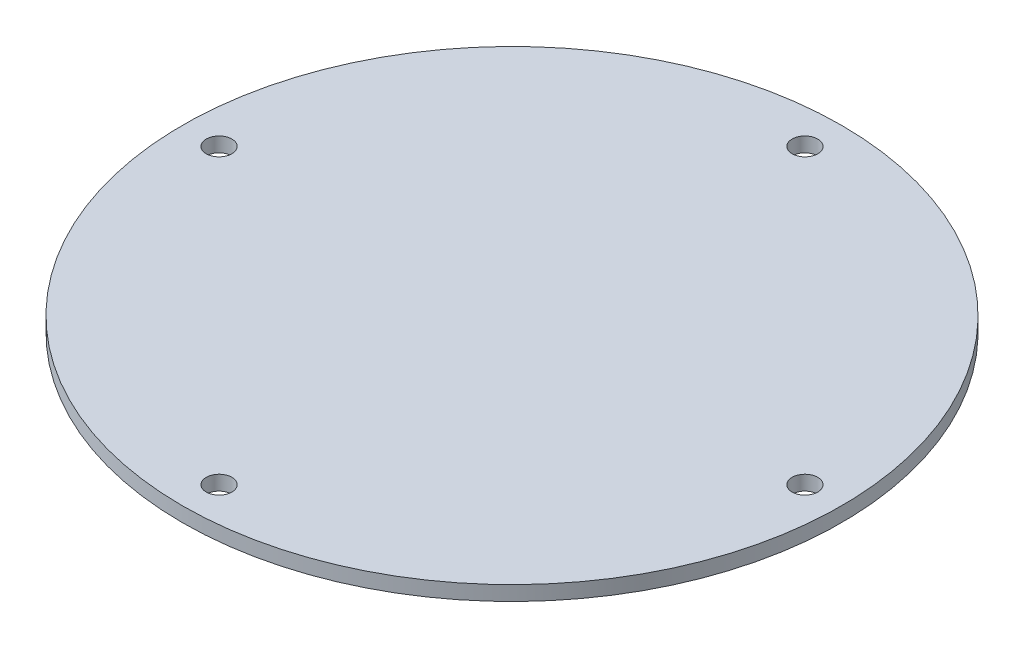
ISO-10303-21;
HEADER;
FILE_DESCRIPTION(('STEP AP214'),'2;1');
FILE_NAME('part.step','',(''),(''),'','','');
FILE_SCHEMA(('AUTOMOTIVE_DESIGN { 1 0 10303 214 1 1 1 1 }'));
ENDSEC;
DATA;
#1=APPLICATION_CONTEXT('core data for automotive mechanical design processes');
#2=APPLICATION_PROTOCOL_DEFINITION('international standard','automotive_design',2000,#1);
#3=PRODUCT_CONTEXT('',#1,'mechanical');
#4=PRODUCT('Part','Part','',(#3));
#5=PRODUCT_RELATED_PRODUCT_CATEGORY('part','',(#4));
#6=PRODUCT_DEFINITION_FORMATION('','',#4);
#7=PRODUCT_DEFINITION_CONTEXT('part definition',#1,'design');
#8=PRODUCT_DEFINITION('design','',#6,#7);
#9=PRODUCT_DEFINITION_SHAPE('','',#8);
#10=(LENGTH_UNIT() NAMED_UNIT(*) SI_UNIT(.MILLI.,.METRE.));
#11=(NAMED_UNIT(*) PLANE_ANGLE_UNIT() SI_UNIT($,.RADIAN.));
#12=(NAMED_UNIT(*) SI_UNIT($,.STERADIAN.) SOLID_ANGLE_UNIT());
#13=UNCERTAINTY_MEASURE_WITH_UNIT(LENGTH_MEASURE(1.E-05),#10,'distance_accuracy_value','');
#14=(GEOMETRIC_REPRESENTATION_CONTEXT(3) GLOBAL_UNCERTAINTY_ASSIGNED_CONTEXT((#13)) GLOBAL_UNIT_ASSIGNED_CONTEXT((#10,
#11,#12)) REPRESENTATION_CONTEXT('',''));
#15=CARTESIAN_POINT('',(0.,0.,0.));
#16=DIRECTION('',(0.,0.,1.));
#17=DIRECTION('',(1.,0.,0.));
#18=AXIS2_PLACEMENT_3D('',#15,#16,#17);
#19=CARTESIAN_POINT('',(0.,2.,0.));
#20=DIRECTION('',(0.,-1.,0.));
#21=DIRECTION('',(0.,0.,-1.));
#22=AXIS2_PLACEMENT_3D('',#19,#20,#21);
#23=CYLINDRICAL_SURFACE('',#22,45.);
#24=CARTESIAN_POINT('',(0.,2.,0.));
#25=DIRECTION('',(0.,1.,0.));
#26=DIRECTION('',(0.,0.,1.));
#27=AXIS2_PLACEMENT_3D('',#24,#25,#26);
#28=CIRCLE('',#27,45.);
#29=CARTESIAN_POINT('',(0.,2.,45.));
#30=VERTEX_POINT('',#29);
#31=EDGE_CURVE('E10',#30,#30,#28,.T.);
#32=ORIENTED_EDGE('',*,*,#31,.F.);
#33=EDGE_LOOP('',(#32));
#34=FACE_BOUND('',#33,.T.);
#35=CARTESIAN_POINT('',(0.,0.,0.));
#36=DIRECTION('',(0.,1.,0.));
#37=DIRECTION('',(0.,0.,1.));
#38=AXIS2_PLACEMENT_3D('',#35,#36,#37);
#39=CIRCLE('',#38,45.);
#40=CARTESIAN_POINT('',(0.,0.,45.));
#41=VERTEX_POINT('',#40);
#42=EDGE_CURVE('E34',#41,#41,#39,.T.);
#43=ORIENTED_EDGE('',*,*,#42,.T.);
#44=EDGE_LOOP('',(#43));
#45=FACE_BOUND('',#44,.T.);
#46=ADVANCED_FACE('F31',(#34,#45),#23,.T.);
#47=CARTESIAN_POINT('',(0.,2.,0.));
#48=DIRECTION('',(0.,1.,0.));
#49=DIRECTION('',(0.,0.,1.));
#50=AXIS2_PLACEMENT_3D('',#47,#48,#49);
#51=PLANE('',#50);
#52=CARTESIAN_POINT('',(0.,2.,-40.));
#53=DIRECTION('',(0.,1.,0.));
#54=DIRECTION('',(0.,0.,1.));
#55=AXIS2_PLACEMENT_3D('',#52,#53,#54);
#56=CIRCLE('',#55,1.75);
#57=CARTESIAN_POINT('',(0.,2.,-38.25));
#58=VERTEX_POINT('',#57);
#59=EDGE_CURVE('E61',#58,#58,#56,.T.);
#60=ORIENTED_EDGE('',*,*,#59,.F.);
#61=EDGE_LOOP('',(#60));
#62=FACE_BOUND('',#61,.T.);
#63=CARTESIAN_POINT('',(40.,2.,0.));
#64=DIRECTION('',(0.,1.,0.));
#65=DIRECTION('',(0.,0.,1.));
#66=AXIS2_PLACEMENT_3D('',#63,#64,#65);
#67=CIRCLE('',#66,1.75);
#68=CARTESIAN_POINT('',(40.,2.,1.75));
#69=VERTEX_POINT('',#68);
#70=EDGE_CURVE('E55',#69,#69,#67,.T.);
#71=ORIENTED_EDGE('',*,*,#70,.F.);
#72=EDGE_LOOP('',(#71));
#73=FACE_BOUND('',#72,.T.);
#74=CARTESIAN_POINT('',(0.,2.,40.));
#75=DIRECTION('',(0.,1.,0.));
#76=DIRECTION('',(0.,0.,1.));
#77=AXIS2_PLACEMENT_3D('',#74,#75,#76);
#78=CIRCLE('',#77,1.75);
#79=CARTESIAN_POINT('',(0.,2.,41.75));
#80=VERTEX_POINT('',#79);
#81=EDGE_CURVE('E49',#80,#80,#78,.T.);
#82=ORIENTED_EDGE('',*,*,#81,.F.);
#83=EDGE_LOOP('',(#82));
#84=FACE_BOUND('',#83,.T.);
#85=CARTESIAN_POINT('',(-40.,2.,0.));
#86=DIRECTION('',(0.,1.,0.));
#87=DIRECTION('',(0.,0.,1.));
#88=AXIS2_PLACEMENT_3D('',#85,#86,#87);
#89=CIRCLE('',#88,1.75);
#90=CARTESIAN_POINT('',(-40.,2.,1.75));
#91=VERTEX_POINT('',#90);
#92=EDGE_CURVE('E43',#91,#91,#89,.T.);
#93=ORIENTED_EDGE('',*,*,#92,.F.);
#94=EDGE_LOOP('',(#93));
#95=FACE_BOUND('',#94,.T.);
#96=ORIENTED_EDGE('',*,*,#31,.T.);
#97=EDGE_LOOP('',(#96));
#98=FACE_BOUND('',#97,.T.);
#99=ADVANCED_FACE('F77',(#62,#73,#84,#95,#98),#51,.T.);
#100=CARTESIAN_POINT('',(0.,0.,0.));
#101=DIRECTION('',(0.,1.,0.));
#102=DIRECTION('',(0.,0.,1.));
#103=AXIS2_PLACEMENT_3D('',#100,#101,#102);
#104=PLANE('',#103);
#105=CARTESIAN_POINT('',(0.,0.,-40.));
#106=DIRECTION('',(0.,1.,0.));
#107=DIRECTION('',(0.,0.,1.));
#108=AXIS2_PLACEMENT_3D('',#105,#106,#107);
#109=CIRCLE('',#108,1.75);
#110=CARTESIAN_POINT('',(0.,0.,-38.25));
#111=VERTEX_POINT('',#110);
#112=EDGE_CURVE('E41',#111,#111,#109,.T.);
#113=ORIENTED_EDGE('',*,*,#112,.T.);
#114=EDGE_LOOP('',(#113));
#115=FACE_BOUND('',#114,.T.);
#116=CARTESIAN_POINT('',(40.,0.,0.));
#117=DIRECTION('',(0.,1.,0.));
#118=DIRECTION('',(0.,0.,1.));
#119=AXIS2_PLACEMENT_3D('',#116,#117,#118);
#120=CIRCLE('',#119,1.75);
#121=CARTESIAN_POINT('',(40.,0.,1.75));
#122=VERTEX_POINT('',#121);
#123=EDGE_CURVE('E58',#122,#122,#120,.T.);
#124=ORIENTED_EDGE('',*,*,#123,.T.);
#125=EDGE_LOOP('',(#124));
#126=FACE_BOUND('',#125,.T.);
#127=CARTESIAN_POINT('',(0.,0.,40.));
#128=DIRECTION('',(0.,1.,0.));
#129=DIRECTION('',(0.,0.,1.));
#130=AXIS2_PLACEMENT_3D('',#127,#128,#129);
#131=CIRCLE('',#130,1.75);
#132=CARTESIAN_POINT('',(0.,0.,41.75));
#133=VERTEX_POINT('',#132);
#134=EDGE_CURVE('E52',#133,#133,#131,.T.);
#135=ORIENTED_EDGE('',*,*,#134,.T.);
#136=EDGE_LOOP('',(#135));
#137=FACE_BOUND('',#136,.T.);
#138=CARTESIAN_POINT('',(-40.,0.,0.));
#139=DIRECTION('',(0.,1.,0.));
#140=DIRECTION('',(0.,0.,1.));
#141=AXIS2_PLACEMENT_3D('',#138,#139,#140);
#142=CIRCLE('',#141,1.75);
#143=CARTESIAN_POINT('',(-40.,0.,1.75));
#144=VERTEX_POINT('',#143);
#145=EDGE_CURVE('E46',#144,#144,#142,.T.);
#146=ORIENTED_EDGE('',*,*,#145,.T.);
#147=EDGE_LOOP('',(#146));
#148=FACE_BOUND('',#147,.T.);
#149=ORIENTED_EDGE('',*,*,#42,.F.);
#150=EDGE_LOOP('',(#149));
#151=FACE_BOUND('',#150,.T.);
#152=ADVANCED_FACE('F67',(#115,#126,#137,#148,#151),#104,.F.);
#153=CARTESIAN_POINT('',(-40.,0.,0.));
#154=DIRECTION('',(0.,1.,0.));
#155=DIRECTION('',(0.,0.,1.));
#156=AXIS2_PLACEMENT_3D('',#153,#154,#155);
#157=CYLINDRICAL_SURFACE('',#156,1.75);
#158=ORIENTED_EDGE('',*,*,#145,.F.);
#159=EDGE_LOOP('',(#158));
#160=FACE_BOUND('',#159,.T.);
#161=ORIENTED_EDGE('',*,*,#92,.T.);
#162=EDGE_LOOP('',(#161));
#163=FACE_BOUND('',#162,.T.);
#164=ADVANCED_FACE('F87',(#160,#163),#157,.F.);
#165=CARTESIAN_POINT('',(0.,0.,40.));
#166=DIRECTION('',(0.,1.,0.));
#167=DIRECTION('',(0.,0.,1.));
#168=AXIS2_PLACEMENT_3D('',#165,#166,#167);
#169=CYLINDRICAL_SURFACE('',#168,1.75);
#170=ORIENTED_EDGE('',*,*,#134,.F.);
#171=EDGE_LOOP('',(#170));
#172=FACE_BOUND('',#171,.T.);
#173=ORIENTED_EDGE('',*,*,#81,.T.);
#174=EDGE_LOOP('',(#173));
#175=FACE_BOUND('',#174,.T.);
#176=ADVANCED_FACE('F89',(#172,#175),#169,.F.);
#177=CARTESIAN_POINT('',(40.,0.,0.));
#178=DIRECTION('',(0.,1.,0.));
#179=DIRECTION('',(0.,0.,1.));
#180=AXIS2_PLACEMENT_3D('',#177,#178,#179);
#181=CYLINDRICAL_SURFACE('',#180,1.75);
#182=ORIENTED_EDGE('',*,*,#123,.F.);
#183=EDGE_LOOP('',(#182));
#184=FACE_BOUND('',#183,.T.);
#185=ORIENTED_EDGE('',*,*,#70,.T.);
#186=EDGE_LOOP('',(#185));
#187=FACE_BOUND('',#186,.T.);
#188=ADVANCED_FACE('F73',(#184,#187),#181,.F.);
#189=CARTESIAN_POINT('',(0.,0.,-40.));
#190=DIRECTION('',(0.,1.,0.));
#191=DIRECTION('',(0.,0.,1.));
#192=AXIS2_PLACEMENT_3D('',#189,#190,#191);
#193=CYLINDRICAL_SURFACE('',#192,1.75);
#194=ORIENTED_EDGE('',*,*,#112,.F.);
#195=EDGE_LOOP('',(#194));
#196=FACE_BOUND('',#195,.T.);
#197=ORIENTED_EDGE('',*,*,#59,.T.);
#198=EDGE_LOOP('',(#197));
#199=FACE_BOUND('',#198,.T.);
#200=ADVANCED_FACE('F70',(#196,#199),#193,.F.);
#201=CLOSED_SHELL('',(#46,#99,#152,#164,#176,#188,#200));
#202=MANIFOLD_SOLID_BREP('B2',#201);
#203=ADVANCED_BREP_SHAPE_REPRESENTATION('',(#18,#202),#14);
#204=SHAPE_DEFINITION_REPRESENTATION(#9,#203);
ENDSEC;
END-ISO-10303-21;
